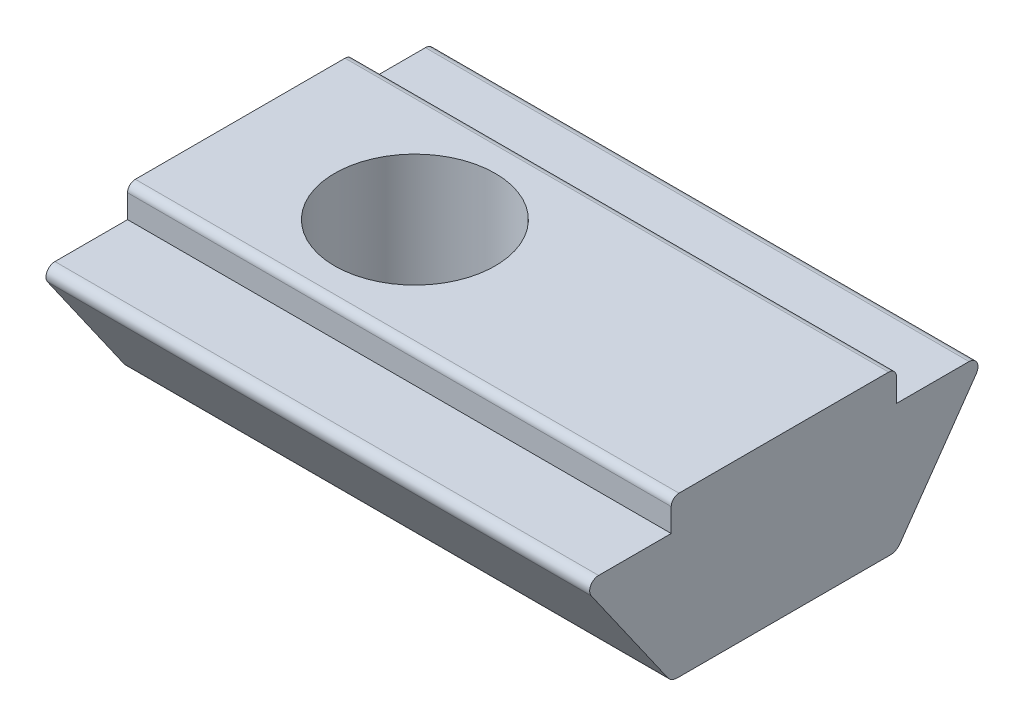
ISO-10303-21;
HEADER;
FILE_DESCRIPTION(('STEP AP214'),'2;1');
FILE_NAME('part.step','',(''),(''),'','','');
FILE_SCHEMA(('AUTOMOTIVE_DESIGN { 1 0 10303 214 1 1 1 1 }'));
ENDSEC;
DATA;
#1=APPLICATION_CONTEXT('core data for automotive mechanical design processes');
#2=APPLICATION_PROTOCOL_DEFINITION('international standard','automotive_design',2000,#1);
#3=PRODUCT_CONTEXT('',#1,'mechanical');
#4=PRODUCT('Part','Part','',(#3));
#5=PRODUCT_RELATED_PRODUCT_CATEGORY('part','',(#4));
#6=PRODUCT_DEFINITION_FORMATION('','',#4);
#7=PRODUCT_DEFINITION_CONTEXT('part definition',#1,'design');
#8=PRODUCT_DEFINITION('design','',#6,#7);
#9=PRODUCT_DEFINITION_SHAPE('','',#8);
#10=(LENGTH_UNIT() NAMED_UNIT(*) SI_UNIT(.MILLI.,.METRE.));
#11=(NAMED_UNIT(*) PLANE_ANGLE_UNIT() SI_UNIT($,.RADIAN.));
#12=(NAMED_UNIT(*) SI_UNIT($,.STERADIAN.) SOLID_ANGLE_UNIT());
#13=UNCERTAINTY_MEASURE_WITH_UNIT(LENGTH_MEASURE(1.E-05),#10,'distance_accuracy_value','');
#14=(GEOMETRIC_REPRESENTATION_CONTEXT(3) GLOBAL_UNCERTAINTY_ASSIGNED_CONTEXT((#13)) GLOBAL_UNIT_ASSIGNED_CONTEXT((#10,
#11,#12)) REPRESENTATION_CONTEXT('',''));
#15=CARTESIAN_POINT('',(0.,0.,0.));
#16=DIRECTION('',(0.,0.,1.));
#17=DIRECTION('',(1.,0.,0.));
#18=AXIS2_PLACEMENT_3D('',#15,#16,#17);
#19=CARTESIAN_POINT('',(6.,-3.9,0.));
#20=DIRECTION('',(0.,-1.,0.));
#21=DIRECTION('',(0.,0.,-1.));
#22=AXIS2_PLACEMENT_3D('',#19,#20,#21);
#23=PLANE('',#22);
#24=CARTESIAN_POINT('',(6.,-3.9,0.));
#25=DIRECTION('',(0.,1.,0.));
#26=DIRECTION('',(0.,0.,1.));
#27=AXIS2_PLACEMENT_3D('',#24,#25,#26);
#28=CIRCLE('',#27,2.1);
#29=CARTESIAN_POINT('',(6.,-3.9,2.1));
#30=VERTEX_POINT('',#29);
#31=EDGE_CURVE('E460',#30,#30,#28,.T.);
#32=ORIENTED_EDGE('',*,*,#31,.F.);
#33=EDGE_LOOP('',(#32));
#34=FACE_BOUND('',#33,.T.);
#35=CARTESIAN_POINT('',(6.,-3.9,0.));
#36=DIRECTION('',(0.,1.,0.));
#37=DIRECTION('',(0.,0.,1.));
#38=AXIS2_PLACEMENT_3D('',#35,#36,#37);
#39=CIRCLE('',#38,1.67032930884901);
#40=CARTESIAN_POINT('',(6.,-3.9,1.67032930884901));
#41=VERTEX_POINT('',#40);
#42=EDGE_CURVE('E459',#41,#41,#39,.T.);
#43=ORIENTED_EDGE('',*,*,#42,.T.);
#44=EDGE_LOOP('',(#43));
#45=FACE_BOUND('',#44,.T.);
#46=ADVANCED_FACE('F45',(#34,#45),#23,.T.);
#47=CARTESIAN_POINT('',(9.5,-4.1,2.9));
#48=DIRECTION('',(0.,1.,0.));
#49=DIRECTION('',(0.,0.,1.));
#50=AXIS2_PLACEMENT_3D('',#47,#48,#49);
#51=PLANE('',#50);
#52=CARTESIAN_POINT('',(0.,-4.1,0.));
#53=DIRECTION('',(0.,1.,0.));
#54=DIRECTION('',(0.,0.,1.));
#55=AXIS2_PLACEMENT_3D('',#52,#53,#54);
#56=CIRCLE('',#55,2.067);
#57=CARTESIAN_POINT('',(0.,-4.1,2.067));
#58=VERTEX_POINT('',#57);
#59=EDGE_CURVE('E49',#58,#58,#56,.T.);
#60=ORIENTED_EDGE('',*,*,#59,.T.);
#61=EDGE_LOOP('',(#60));
#62=FACE_BOUND('',#61,.T.);
#63=DIRECTION('',(0.,0.,-1.));
#64=VECTOR('',#63,1.);
#65=CARTESIAN_POINT('',(9.5,-4.1,2.9));
#66=LINE('',#65,#64);
#67=CARTESIAN_POINT('',(9.5,-4.1,2.74387955376189));
#68=VERTEX_POINT('',#67);
#69=CARTESIAN_POINT('',(9.5,-4.1,-2.74387955376189));
#70=VERTEX_POINT('',#69);
#71=EDGE_CURVE('E181',#68,#70,#66,.T.);
#72=ORIENTED_EDGE('',*,*,#71,.F.);
#73=DIRECTION('',(-1.,0.,0.));
#74=VECTOR('',#73,1.);
#75=CARTESIAN_POINT('',(9.5,-4.1,2.74387955376189));
#76=LINE('',#75,#74);
#77=CARTESIAN_POINT('',(-4.5,-4.1,2.74387955376189));
#78=VERTEX_POINT('',#77);
#79=EDGE_CURVE('E227',#68,#78,#76,.T.);
#80=ORIENTED_EDGE('',*,*,#79,.T.);
#81=DIRECTION('',(0.,0.,-1.));
#82=VECTOR('',#81,1.);
#83=CARTESIAN_POINT('',(-4.5,-4.1,2.9));
#84=LINE('',#83,#82);
#85=CARTESIAN_POINT('',(-4.5,-4.1,-2.74387955376189));
#86=VERTEX_POINT('',#85);
#87=EDGE_CURVE('E204',#78,#86,#84,.T.);
#88=ORIENTED_EDGE('',*,*,#87,.T.);
#89=DIRECTION('',(-1.,0.,0.));
#90=VECTOR('',#89,1.);
#91=CARTESIAN_POINT('',(9.5,-4.1,-2.74387955376189));
#92=LINE('',#91,#90);
#93=EDGE_CURVE('E167',#86,#70,#92,.F.);
#94=ORIENTED_EDGE('',*,*,#93,.T.);
#95=EDGE_LOOP('',(#72,#80,#88,#94));
#96=FACE_BOUND('',#95,.T.);
#97=CARTESIAN_POINT('',(6.,-4.1,0.));
#98=DIRECTION('',(0.,1.,0.));
#99=DIRECTION('',(0.,0.,1.));
#100=AXIS2_PLACEMENT_3D('',#97,#98,#99);
#101=CIRCLE('',#100,2.1);
#102=CARTESIAN_POINT('',(6.,-4.1,2.1));
#103=VERTEX_POINT('',#102);
#104=EDGE_CURVE('E194',#103,#103,#101,.T.);
#105=ORIENTED_EDGE('',*,*,#104,.T.);
#106=EDGE_LOOP('',(#105));
#107=FACE_BOUND('',#106,.T.);
#108=ADVANCED_FACE('F287',(#62,#96,#107),#51,.F.);
#109=CARTESIAN_POINT('',(9.5,-0.8,-2.9));
#110=DIRECTION('',(0.,0.,1.));
#111=DIRECTION('',(0.,-1.,0.));
#112=AXIS2_PLACEMENT_3D('',#109,#110,#111);
#113=PLANE('',#112);
#114=DIRECTION('',(0.,1.,0.));
#115=VECTOR('',#114,1.);
#116=CARTESIAN_POINT('',(-4.5,-0.8,-2.9));
#117=LINE('',#116,#115);
#118=CARTESIAN_POINT('',(-4.5,-0.8,-2.9));
#119=VERTEX_POINT('',#118);
#120=CARTESIAN_POINT('',(-4.5,-0.2,-2.9));
#121=VERTEX_POINT('',#120);
#122=EDGE_CURVE('E191',#119,#121,#117,.T.);
#123=ORIENTED_EDGE('',*,*,#122,.T.);
#124=DIRECTION('',(-1.,0.,0.));
#125=VECTOR('',#124,1.);
#126=CARTESIAN_POINT('',(9.5,-0.2,-2.9));
#127=LINE('',#126,#125);
#128=CARTESIAN_POINT('',(9.5,-0.2,-2.9));
#129=VERTEX_POINT('',#128);
#130=EDGE_CURVE('E11',#121,#129,#127,.F.);
#131=ORIENTED_EDGE('',*,*,#130,.T.);
#132=DIRECTION('',(0.,1.,0.));
#133=VECTOR('',#132,1.);
#134=CARTESIAN_POINT('',(9.5,-0.8,-2.9));
#135=LINE('',#134,#133);
#136=CARTESIAN_POINT('',(9.5,-0.8,-2.9));
#137=VERTEX_POINT('',#136);
#138=EDGE_CURVE('E213',#137,#129,#135,.T.);
#139=ORIENTED_EDGE('',*,*,#138,.F.);
#140=DIRECTION('',(-1.,0.,0.));
#141=VECTOR('',#140,1.);
#142=CARTESIAN_POINT('',(9.5,-0.8,-2.9));
#143=LINE('',#142,#141);
#144=EDGE_CURVE('E190',#137,#119,#143,.T.);
#145=ORIENTED_EDGE('',*,*,#144,.T.);
#146=EDGE_LOOP('',(#123,#131,#139,#145));
#147=FACE_BOUND('',#146,.T.);
#148=ADVANCED_FACE('F264',(#147),#113,.F.);
#149=CARTESIAN_POINT('',(9.5,0.,-2.9));
#150=DIRECTION('',(0.,-1.,0.));
#151=DIRECTION('',(0.,0.,-1.));
#152=AXIS2_PLACEMENT_3D('',#149,#150,#151);
#153=PLANE('',#152);
#154=CARTESIAN_POINT('',(0.,0.,0.));
#155=DIRECTION('',(0.,1.,0.));
#156=DIRECTION('',(0.,0.,1.));
#157=AXIS2_PLACEMENT_3D('',#154,#155,#156);
#158=CIRCLE('',#157,2.067);
#159=CARTESIAN_POINT('',(0.,0.,2.067));
#160=VERTEX_POINT('',#159);
#161=EDGE_CURVE('E465',#160,#160,#158,.T.);
#162=ORIENTED_EDGE('',*,*,#161,.F.);
#163=EDGE_LOOP('',(#162));
#164=FACE_BOUND('',#163,.T.);
#165=DIRECTION('',(0.,0.,1.));
#166=VECTOR('',#165,1.);
#167=CARTESIAN_POINT('',(-4.5,0.,-2.9));
#168=LINE('',#167,#166);
#169=CARTESIAN_POINT('',(-4.5,0.,-2.7));
#170=VERTEX_POINT('',#169);
#171=CARTESIAN_POINT('',(-4.5,0.,2.7));
#172=VERTEX_POINT('',#171);
#173=EDGE_CURVE('E193',#170,#172,#168,.T.);
#174=ORIENTED_EDGE('',*,*,#173,.T.);
#175=DIRECTION('',(-1.,0.,0.));
#176=VECTOR('',#175,1.);
#177=CARTESIAN_POINT('',(9.5,0.,2.7));
#178=LINE('',#177,#176);
#179=CARTESIAN_POINT('',(9.5,0.,2.7));
#180=VERTEX_POINT('',#179);
#181=EDGE_CURVE('E67',#172,#180,#178,.F.);
#182=ORIENTED_EDGE('',*,*,#181,.T.);
#183=DIRECTION('',(0.,0.,1.));
#184=VECTOR('',#183,1.);
#185=CARTESIAN_POINT('',(9.5,0.,-2.9));
#186=LINE('',#185,#184);
#187=CARTESIAN_POINT('',(9.5,0.,-2.7));
#188=VERTEX_POINT('',#187);
#189=EDGE_CURVE('E158',#188,#180,#186,.T.);
#190=ORIENTED_EDGE('',*,*,#189,.F.);
#191=DIRECTION('',(-1.,0.,0.));
#192=VECTOR('',#191,1.);
#193=CARTESIAN_POINT('',(9.5,0.,-2.7));
#194=LINE('',#193,#192);
#195=EDGE_CURVE('E249',#188,#170,#194,.T.);
#196=ORIENTED_EDGE('',*,*,#195,.T.);
#197=EDGE_LOOP('',(#174,#182,#190,#196));
#198=FACE_BOUND('',#197,.T.);
#199=ADVANCED_FACE('F258',(#164,#198),#153,.F.);
#200=CARTESIAN_POINT('',(9.5,0.,2.9));
#201=DIRECTION('',(0.,0.,-1.));
#202=DIRECTION('',(0.,1.,0.));
#203=AXIS2_PLACEMENT_3D('',#200,#201,#202);
#204=PLANE('',#203);
#205=DIRECTION('',(0.,-1.,0.));
#206=VECTOR('',#205,1.);
#207=CARTESIAN_POINT('',(9.5,0.,2.9));
#208=LINE('',#207,#206);
#209=CARTESIAN_POINT('',(9.5,-0.2,2.9));
#210=VERTEX_POINT('',#209);
#211=CARTESIAN_POINT('',(9.5,-0.8,2.9));
#212=VERTEX_POINT('',#211);
#213=EDGE_CURVE('E148',#210,#212,#208,.T.);
#214=ORIENTED_EDGE('',*,*,#213,.F.);
#215=DIRECTION('',(-1.,0.,0.));
#216=VECTOR('',#215,1.);
#217=CARTESIAN_POINT('',(9.5,-0.2,2.9));
#218=LINE('',#217,#216);
#219=CARTESIAN_POINT('',(-4.5,-0.2,2.9));
#220=VERTEX_POINT('',#219);
#221=EDGE_CURVE('E243',#210,#220,#218,.T.);
#222=ORIENTED_EDGE('',*,*,#221,.T.);
#223=DIRECTION('',(0.,-1.,0.));
#224=VECTOR('',#223,1.);
#225=CARTESIAN_POINT('',(-4.5,0.,2.9));
#226=LINE('',#225,#224);
#227=CARTESIAN_POINT('',(-4.5,-0.8,2.9));
#228=VERTEX_POINT('',#227);
#229=EDGE_CURVE('E164',#220,#228,#226,.T.);
#230=ORIENTED_EDGE('',*,*,#229,.T.);
#231=DIRECTION('',(-1.,0.,0.));
#232=VECTOR('',#231,1.);
#233=CARTESIAN_POINT('',(9.5,-0.8,2.9));
#234=LINE('',#233,#232);
#235=EDGE_CURVE('E161',#212,#228,#234,.T.);
#236=ORIENTED_EDGE('',*,*,#235,.F.);
#237=EDGE_LOOP('',(#214,#222,#230,#236));
#238=FACE_BOUND('',#237,.T.);
#239=ADVANCED_FACE('F162',(#238),#204,.F.);
#240=CARTESIAN_POINT('',(9.5,-0.8,2.9));
#241=DIRECTION('',(0.,-1.,0.));
#242=DIRECTION('',(0.,0.,-1.));
#243=AXIS2_PLACEMENT_3D('',#240,#241,#242);
#244=PLANE('',#243);
#245=DIRECTION('',(0.,0.,1.));
#246=VECTOR('',#245,1.);
#247=CARTESIAN_POINT('',(-4.5,-0.8,2.9));
#248=LINE('',#247,#246);
#249=CARTESIAN_POINT('',(-4.5,-0.8,4.77));
#250=VERTEX_POINT('',#249);
#251=EDGE_CURVE('E197',#228,#250,#248,.T.);
#252=ORIENTED_EDGE('',*,*,#251,.T.);
#253=DIRECTION('',(-1.,0.,0.));
#254=VECTOR('',#253,1.);
#255=CARTESIAN_POINT('',(9.5,-0.8,4.77));
#256=LINE('',#255,#254);
#257=CARTESIAN_POINT('',(9.5,-0.8,4.77));
#258=VERTEX_POINT('',#257);
#259=EDGE_CURVE('E168',#258,#250,#256,.T.);
#260=ORIENTED_EDGE('',*,*,#259,.F.);
#261=DIRECTION('',(0.,0.,1.));
#262=VECTOR('',#261,1.);
#263=CARTESIAN_POINT('',(9.5,-0.8,2.9));
#264=LINE('',#263,#262);
#265=EDGE_CURVE('E152',#212,#258,#264,.T.);
#266=ORIENTED_EDGE('',*,*,#265,.F.);
#267=ORIENTED_EDGE('',*,*,#235,.T.);
#268=EDGE_LOOP('',(#252,#260,#266,#267));
#269=FACE_BOUND('',#268,.T.);
#270=ADVANCED_FACE('F170',(#269),#244,.F.);
#271=CARTESIAN_POINT('',(9.5,-1.03,4.77));
#272=DIRECTION('',(-1.,0.,0.));
#273=DIRECTION('',(0.,0.,1.));
#274=AXIS2_PLACEMENT_3D('',#271,#272,#273);
#275=CYLINDRICAL_SURFACE('',#274,0.229999999999999);
#276=CARTESIAN_POINT('',(-4.5,-1.03,4.77));
#277=DIRECTION('',(1.,0.,0.));
#278=DIRECTION('',(0.,0.,1.));
#279=AXIS2_PLACEMENT_3D('',#276,#277,#278);
#280=CIRCLE('',#279,0.229999999999999);
#281=CARTESIAN_POINT('',(-4.5,-1.16197166363797,4.95837059217571));
#282=VERTEX_POINT('',#281);
#283=EDGE_CURVE('E199',#250,#282,#280,.T.);
#284=ORIENTED_EDGE('',*,*,#283,.T.);
#285=DIRECTION('',(-1.,0.,0.));
#286=VECTOR('',#285,1.);
#287=CARTESIAN_POINT('',(9.5,-1.16197166363797,4.95837059217571));
#288=LINE('',#287,#286);
#289=CARTESIAN_POINT('',(9.5,-1.16197166363797,4.95837059217571));
#290=VERTEX_POINT('',#289);
#291=EDGE_CURVE('E222',#290,#282,#288,.T.);
#292=ORIENTED_EDGE('',*,*,#291,.F.);
#293=CARTESIAN_POINT('',(9.5,-1.03,4.77));
#294=DIRECTION('',(1.,0.,0.));
#295=DIRECTION('',(0.,0.,1.));
#296=AXIS2_PLACEMENT_3D('',#293,#294,#295);
#297=CIRCLE('',#296,0.229999999999999);
#298=EDGE_CURVE('E173',#258,#290,#297,.T.);
#299=ORIENTED_EDGE('',*,*,#298,.F.);
#300=ORIENTED_EDGE('',*,*,#259,.T.);
#301=EDGE_LOOP('',(#284,#292,#299,#300));
#302=FACE_BOUND('',#301,.T.);
#303=ADVANCED_FACE('F301',(#302),#275,.T.);
#304=CARTESIAN_POINT('',(9.5,-1.16197166363797,4.95837059217571));
#305=DIRECTION('',(0.,0.573789841904221,-0.819002574676984));
#306=DIRECTION('',(0.,0.819002574676984,0.573789841904221));
#307=AXIS2_PLACEMENT_3D('',#304,#305,#306);
#308=PLANE('',#307);
#309=DIRECTION('',(0.,-0.819002574676984,-0.573789841904221));
#310=VECTOR('',#309,1.);
#311=CARTESIAN_POINT('',(-4.5,-1.16197166363797,4.95837059217571));
#312=LINE('',#311,#310);
#313=CARTESIAN_POINT('',(-4.5,-3.97213695257127,2.98958032616498));
#314=VERTEX_POINT('',#313);
#315=EDGE_CURVE('E201',#282,#314,#312,.T.);
#316=ORIENTED_EDGE('',*,*,#315,.T.);
#317=DIRECTION('',(-1.,0.,0.));
#318=VECTOR('',#317,1.);
#319=CARTESIAN_POINT('',(9.5,-3.97213695257127,2.98958032616498));
#320=LINE('',#319,#318);
#321=CARTESIAN_POINT('',(9.5,-3.97213695257127,2.98958032616498));
#322=VERTEX_POINT('',#321);
#323=EDGE_CURVE('E234',#314,#322,#320,.F.);
#324=ORIENTED_EDGE('',*,*,#323,.T.);
#325=DIRECTION('',(0.,-0.819002574676984,-0.573789841904221));
#326=VECTOR('',#325,1.);
#327=CARTESIAN_POINT('',(9.5,-1.16197166363797,4.95837059217571));
#328=LINE('',#327,#326);
#329=EDGE_CURVE('E175',#290,#322,#328,.T.);
#330=ORIENTED_EDGE('',*,*,#329,.F.);
#331=ORIENTED_EDGE('',*,*,#291,.T.);
#332=EDGE_LOOP('',(#316,#324,#330,#331));
#333=FACE_BOUND('',#332,.T.);
#334=ADVANCED_FACE('F297',(#333),#308,.F.);
#335=CARTESIAN_POINT('',(9.5,-4.1,-2.9));
#336=DIRECTION('',(0.,0.573789841904222,0.819002574676984));
#337=DIRECTION('',(0.,-0.819002574676984,0.573789841904222));
#338=AXIS2_PLACEMENT_3D('',#335,#336,#337);
#339=PLANE('',#338);
#340=DIRECTION('',(0.,0.819002574676984,-0.573789841904222));
#341=VECTOR('',#340,1.);
#342=CARTESIAN_POINT('',(9.5,-4.1,-2.9));
#343=LINE('',#342,#341);
#344=CARTESIAN_POINT('',(9.5,-3.97213695257127,-2.98958032616498));
#345=VERTEX_POINT('',#344);
#346=CARTESIAN_POINT('',(9.5,-1.16197166363797,-4.95837059217571));
#347=VERTEX_POINT('',#346);
#348=EDGE_CURVE('E184',#345,#347,#343,.T.);
#349=ORIENTED_EDGE('',*,*,#348,.F.);
#350=DIRECTION('',(-1.,0.,0.));
#351=VECTOR('',#350,1.);
#352=CARTESIAN_POINT('',(9.5,-3.97213695257127,-2.98958032616498));
#353=LINE('',#352,#351);
#354=CARTESIAN_POINT('',(-4.5,-3.97213695257127,-2.98958032616498));
#355=VERTEX_POINT('',#354);
#356=EDGE_CURVE('E240',#345,#355,#353,.T.);
#357=ORIENTED_EDGE('',*,*,#356,.T.);
#358=DIRECTION('',(0.,0.819002574676984,-0.573789841904222));
#359=VECTOR('',#358,1.);
#360=CARTESIAN_POINT('',(-4.5,-4.1,-2.9));
#361=LINE('',#360,#359);
#362=CARTESIAN_POINT('',(-4.5,-1.16197166363797,-4.95837059217571));
#363=VERTEX_POINT('',#362);
#364=EDGE_CURVE('E207',#355,#363,#361,.T.);
#365=ORIENTED_EDGE('',*,*,#364,.T.);
#366=DIRECTION('',(-1.,0.,0.));
#367=VECTOR('',#366,1.);
#368=CARTESIAN_POINT('',(9.5,-1.16197166363797,-4.95837059217571));
#369=LINE('',#368,#367);
#370=EDGE_CURVE('E219',#347,#363,#369,.T.);
#371=ORIENTED_EDGE('',*,*,#370,.F.);
#372=EDGE_LOOP('',(#349,#357,#365,#371));
#373=FACE_BOUND('',#372,.T.);
#374=ADVANCED_FACE('F278',(#373),#339,.F.);
#375=CARTESIAN_POINT('',(9.5,-1.03,-4.77));
#376=DIRECTION('',(-1.,0.,0.));
#377=DIRECTION('',(0.,0.,1.));
#378=AXIS2_PLACEMENT_3D('',#375,#376,#377);
#379=CYLINDRICAL_SURFACE('',#378,0.23);
#380=CARTESIAN_POINT('',(-4.5,-1.03,-4.77));
#381=DIRECTION('',(1.,0.,0.));
#382=DIRECTION('',(0.,0.,-1.));
#383=AXIS2_PLACEMENT_3D('',#380,#381,#382);
#384=CIRCLE('',#383,0.23);
#385=CARTESIAN_POINT('',(-4.5,-0.799999999999999,-4.77));
#386=VERTEX_POINT('',#385);
#387=EDGE_CURVE('E209',#363,#386,#384,.T.);
#388=ORIENTED_EDGE('',*,*,#387,.T.);
#389=DIRECTION('',(-1.,0.,0.));
#390=VECTOR('',#389,1.);
#391=CARTESIAN_POINT('',(9.5,-0.799999999999999,-4.77));
#392=LINE('',#391,#390);
#393=CARTESIAN_POINT('',(9.5,-0.799999999999999,-4.77));
#394=VERTEX_POINT('',#393);
#395=EDGE_CURVE('E216',#394,#386,#392,.T.);
#396=ORIENTED_EDGE('',*,*,#395,.F.);
#397=CARTESIAN_POINT('',(9.5,-1.03,-4.77));
#398=DIRECTION('',(1.,0.,0.));
#399=DIRECTION('',(0.,0.,-1.));
#400=AXIS2_PLACEMENT_3D('',#397,#398,#399);
#401=CIRCLE('',#400,0.23);
#402=EDGE_CURVE('E186',#347,#394,#401,.T.);
#403=ORIENTED_EDGE('',*,*,#402,.F.);
#404=ORIENTED_EDGE('',*,*,#370,.T.);
#405=EDGE_LOOP('',(#388,#396,#403,#404));
#406=FACE_BOUND('',#405,.T.);
#407=ADVANCED_FACE('F273',(#406),#379,.T.);
#408=CARTESIAN_POINT('',(9.5,-0.799999999999999,-4.77));
#409=DIRECTION('',(0.,-1.,0.));
#410=DIRECTION('',(0.,0.,-1.));
#411=AXIS2_PLACEMENT_3D('',#408,#409,#410);
#412=PLANE('',#411);
#413=DIRECTION('',(0.,0.,1.));
#414=VECTOR('',#413,1.);
#415=CARTESIAN_POINT('',(-4.5,-0.799999999999999,-4.77));
#416=LINE('',#415,#414);
#417=EDGE_CURVE('E211',#386,#119,#416,.T.);
#418=ORIENTED_EDGE('',*,*,#417,.T.);
#419=ORIENTED_EDGE('',*,*,#144,.F.);
#420=DIRECTION('',(0.,0.,1.));
#421=VECTOR('',#420,1.);
#422=CARTESIAN_POINT('',(9.5,-0.799999999999999,-4.77));
#423=LINE('',#422,#421);
#424=EDGE_CURVE('E188',#394,#137,#423,.T.);
#425=ORIENTED_EDGE('',*,*,#424,.F.);
#426=ORIENTED_EDGE('',*,*,#395,.T.);
#427=EDGE_LOOP('',(#418,#419,#425,#426));
#428=FACE_BOUND('',#427,.T.);
#429=ADVANCED_FACE('F268',(#428),#412,.F.);
#430=CARTESIAN_POINT('',(9.5,-1.03,4.77));
#431=DIRECTION('',(-1.,0.,0.));
#432=DIRECTION('',(0.,0.,1.));
#433=AXIS2_PLACEMENT_3D('',#430,#431,#432);
#434=PLANE('',#433);
#435=ORIENTED_EDGE('',*,*,#189,.T.);
#436=CARTESIAN_POINT('',(9.5,-0.2,2.7));
#437=DIRECTION('',(-1.,0.,0.));
#438=DIRECTION('',(0.,0.,1.));
#439=AXIS2_PLACEMENT_3D('',#436,#437,#438);
#440=CIRCLE('',#439,0.2);
#441=EDGE_CURVE('E54',#180,#210,#440,.F.);
#442=ORIENTED_EDGE('',*,*,#441,.T.);
#443=ORIENTED_EDGE('',*,*,#213,.T.);
#444=ORIENTED_EDGE('',*,*,#265,.T.);
#445=ORIENTED_EDGE('',*,*,#298,.T.);
#446=ORIENTED_EDGE('',*,*,#329,.T.);
#447=CARTESIAN_POINT('',(9.5,-3.8,2.74387955376189));
#448=DIRECTION('',(-1.,0.,0.));
#449=DIRECTION('',(0.,0.,1.));
#450=AXIS2_PLACEMENT_3D('',#447,#448,#449);
#451=CIRCLE('',#450,0.3);
#452=EDGE_CURVE('E238',#322,#68,#451,.F.);
#453=ORIENTED_EDGE('',*,*,#452,.T.);
#454=ORIENTED_EDGE('',*,*,#71,.T.);
#455=CARTESIAN_POINT('',(9.5,-3.8,-2.74387955376189));
#456=DIRECTION('',(-1.,0.,0.));
#457=DIRECTION('',(0.,0.,1.));
#458=AXIS2_PLACEMENT_3D('',#455,#456,#457);
#459=CIRCLE('',#458,0.3);
#460=EDGE_CURVE('E236',#70,#345,#459,.F.);
#461=ORIENTED_EDGE('',*,*,#460,.T.);
#462=ORIENTED_EDGE('',*,*,#348,.T.);
#463=ORIENTED_EDGE('',*,*,#402,.T.);
#464=ORIENTED_EDGE('',*,*,#424,.T.);
#465=ORIENTED_EDGE('',*,*,#138,.T.);
#466=CARTESIAN_POINT('',(9.5,-0.2,-2.7));
#467=DIRECTION('',(-1.,0.,0.));
#468=DIRECTION('',(0.,0.,1.));
#469=AXIS2_PLACEMENT_3D('',#466,#467,#468);
#470=CIRCLE('',#469,0.2);
#471=EDGE_CURVE('E253',#129,#188,#470,.F.);
#472=ORIENTED_EDGE('',*,*,#471,.T.);
#473=EDGE_LOOP('',(#435,#442,#443,#444,#445,#446,#453,#454,#461,#462,#463,#464,#465,#472));
#474=FACE_BOUND('',#473,.T.);
#475=ADVANCED_FACE('F150',(#474),#434,.F.);
#476=CARTESIAN_POINT('',(-4.5,-1.03,4.77));
#477=DIRECTION('',(-1.,0.,0.));
#478=DIRECTION('',(0.,0.,1.));
#479=AXIS2_PLACEMENT_3D('',#476,#477,#478);
#480=PLANE('',#479);
#481=ORIENTED_EDGE('',*,*,#229,.F.);
#482=CARTESIAN_POINT('',(-4.5,-0.2,2.7));
#483=DIRECTION('',(-1.,0.,0.));
#484=DIRECTION('',(0.,0.,1.));
#485=AXIS2_PLACEMENT_3D('',#482,#483,#484);
#486=CIRCLE('',#485,0.2);
#487=EDGE_CURVE('E247',#220,#172,#486,.T.);
#488=ORIENTED_EDGE('',*,*,#487,.T.);
#489=ORIENTED_EDGE('',*,*,#173,.F.);
#490=CARTESIAN_POINT('',(-4.5,-0.2,-2.7));
#491=DIRECTION('',(-1.,0.,0.));
#492=DIRECTION('',(0.,0.,1.));
#493=AXIS2_PLACEMENT_3D('',#490,#491,#492);
#494=CIRCLE('',#493,0.2);
#495=EDGE_CURVE('E245',#170,#121,#494,.T.);
#496=ORIENTED_EDGE('',*,*,#495,.T.);
#497=ORIENTED_EDGE('',*,*,#122,.F.);
#498=ORIENTED_EDGE('',*,*,#417,.F.);
#499=ORIENTED_EDGE('',*,*,#387,.F.);
#500=ORIENTED_EDGE('',*,*,#364,.F.);
#501=CARTESIAN_POINT('',(-4.5,-3.8,-2.74387955376189));
#502=DIRECTION('',(-1.,0.,0.));
#503=DIRECTION('',(0.,0.,1.));
#504=AXIS2_PLACEMENT_3D('',#501,#502,#503);
#505=CIRCLE('',#504,0.3);
#506=EDGE_CURVE('E230',#355,#86,#505,.T.);
#507=ORIENTED_EDGE('',*,*,#506,.T.);
#508=ORIENTED_EDGE('',*,*,#87,.F.);
#509=CARTESIAN_POINT('',(-4.5,-3.8,2.74387955376189));
#510=DIRECTION('',(-1.,0.,0.));
#511=DIRECTION('',(0.,0.,1.));
#512=AXIS2_PLACEMENT_3D('',#509,#510,#511);
#513=CIRCLE('',#512,0.3);
#514=EDGE_CURVE('E232',#78,#314,#513,.T.);
#515=ORIENTED_EDGE('',*,*,#514,.T.);
#516=ORIENTED_EDGE('',*,*,#315,.F.);
#517=ORIENTED_EDGE('',*,*,#283,.F.);
#518=ORIENTED_EDGE('',*,*,#251,.F.);
#519=EDGE_LOOP('',(#481,#488,#489,#496,#497,#498,#499,#500,#507,#508,#515,#516,#517,#518));
#520=FACE_BOUND('',#519,.T.);
#521=ADVANCED_FACE('F262',(#520),#480,.T.);
#522=CARTESIAN_POINT('',(9.5,-3.8,2.74387955376189));
#523=DIRECTION('',(-1.,0.,0.));
#524=DIRECTION('',(0.,0.,1.));
#525=AXIS2_PLACEMENT_3D('',#522,#523,#524);
#526=CYLINDRICAL_SURFACE('',#525,0.3);
#527=ORIENTED_EDGE('',*,*,#452,.F.);
#528=ORIENTED_EDGE('',*,*,#323,.F.);
#529=ORIENTED_EDGE('',*,*,#514,.F.);
#530=ORIENTED_EDGE('',*,*,#79,.F.);
#531=EDGE_LOOP('',(#527,#528,#529,#530));
#532=FACE_BOUND('',#531,.T.);
#533=ADVANCED_FACE('F292',(#532),#526,.T.);
#534=CARTESIAN_POINT('',(9.5,-3.8,-2.74387955376189));
#535=DIRECTION('',(-1.,0.,0.));
#536=DIRECTION('',(0.,0.,1.));
#537=AXIS2_PLACEMENT_3D('',#534,#535,#536);
#538=CYLINDRICAL_SURFACE('',#537,0.3);
#539=ORIENTED_EDGE('',*,*,#460,.F.);
#540=ORIENTED_EDGE('',*,*,#93,.F.);
#541=ORIENTED_EDGE('',*,*,#506,.F.);
#542=ORIENTED_EDGE('',*,*,#356,.F.);
#543=EDGE_LOOP('',(#539,#540,#541,#542));
#544=FACE_BOUND('',#543,.T.);
#545=ADVANCED_FACE('F282',(#544),#538,.T.);
#546=CARTESIAN_POINT('',(9.5,-0.2,2.7));
#547=DIRECTION('',(-1.,0.,0.));
#548=DIRECTION('',(0.,0.,1.));
#549=AXIS2_PLACEMENT_3D('',#546,#547,#548);
#550=CYLINDRICAL_SURFACE('',#549,0.2);
#551=ORIENTED_EDGE('',*,*,#441,.F.);
#552=ORIENTED_EDGE('',*,*,#181,.F.);
#553=ORIENTED_EDGE('',*,*,#487,.F.);
#554=ORIENTED_EDGE('',*,*,#221,.F.);
#555=EDGE_LOOP('',(#551,#552,#553,#554));
#556=FACE_BOUND('',#555,.T.);
#557=ADVANCED_FACE('F303',(#556),#550,.T.);
#558=CARTESIAN_POINT('',(9.5,-0.2,-2.7));
#559=DIRECTION('',(-1.,0.,0.));
#560=DIRECTION('',(0.,0.,1.));
#561=AXIS2_PLACEMENT_3D('',#558,#559,#560);
#562=CYLINDRICAL_SURFACE('',#561,0.2);
#563=ORIENTED_EDGE('',*,*,#471,.F.);
#564=ORIENTED_EDGE('',*,*,#130,.F.);
#565=ORIENTED_EDGE('',*,*,#495,.F.);
#566=ORIENTED_EDGE('',*,*,#195,.F.);
#567=EDGE_LOOP('',(#563,#564,#565,#566));
#568=FACE_BOUND('',#567,.T.);
#569=ADVANCED_FACE('F47',(#568),#562,.T.);
#570=CARTESIAN_POINT('',(6.,1.66554857329047,0.));
#571=DIRECTION('',(0.,1.,0.));
#572=DIRECTION('',(0.,0.,1.));
#573=AXIS2_PLACEMENT_3D('',#570,#571,#572);
#574=CYLINDRICAL_SURFACE('',#573,2.1);
#575=ORIENTED_EDGE('',*,*,#31,.T.);
#576=EDGE_LOOP('',(#575));
#577=FACE_BOUND('',#576,.T.);
#578=ORIENTED_EDGE('',*,*,#104,.F.);
#579=EDGE_LOOP('',(#578));
#580=FACE_BOUND('',#579,.T.);
#581=ADVANCED_FACE('F309',(#577,#580),#574,.F.);
#582=CARTESIAN_POINT('',(6.,-2.8,0.));
#583=DIRECTION('',(0.,1.,0.));
#584=DIRECTION('',(0.,0.,1.));
#585=AXIS2_PLACEMENT_3D('',#582,#583,#584);
#586=SPHERICAL_SURFACE('',#585,2.);
#587=ORIENTED_EDGE('',*,*,#42,.F.);
#588=EDGE_LOOP('',(#587));
#589=FACE_BOUND('',#588,.T.);
#590=ADVANCED_FACE('F326',(#589),#586,.T.);
#591=CARTESIAN_POINT('',(0.,0.,0.));
#592=DIRECTION('',(0.,1.,0.));
#593=DIRECTION('',(0.,0.,1.));
#594=AXIS2_PLACEMENT_3D('',#591,#592,#593);
#595=CYLINDRICAL_SURFACE('',#594,2.067);
#596=ORIENTED_EDGE('',*,*,#161,.T.);
#597=EDGE_LOOP('',(#596));
#598=FACE_BOUND('',#597,.T.);
#599=ORIENTED_EDGE('',*,*,#59,.F.);
#600=EDGE_LOOP('',(#599));
#601=FACE_BOUND('',#600,.T.);
#602=ADVANCED_FACE('F408',(#598,#601),#595,.F.);
#603=CLOSED_SHELL('',(#46,#108,#148,#199,#239,#270,#303,#334,#374,#407,#429,#475,#521,#533,#545,
#557,#569,#581,#590,#602));
#604=MANIFOLD_SOLID_BREP('B2',#603);
#605=ADVANCED_BREP_SHAPE_REPRESENTATION('',(#18,#604),#14);
#606=SHAPE_DEFINITION_REPRESENTATION(#9,#605);
ENDSEC;
END-ISO-10303-21;
